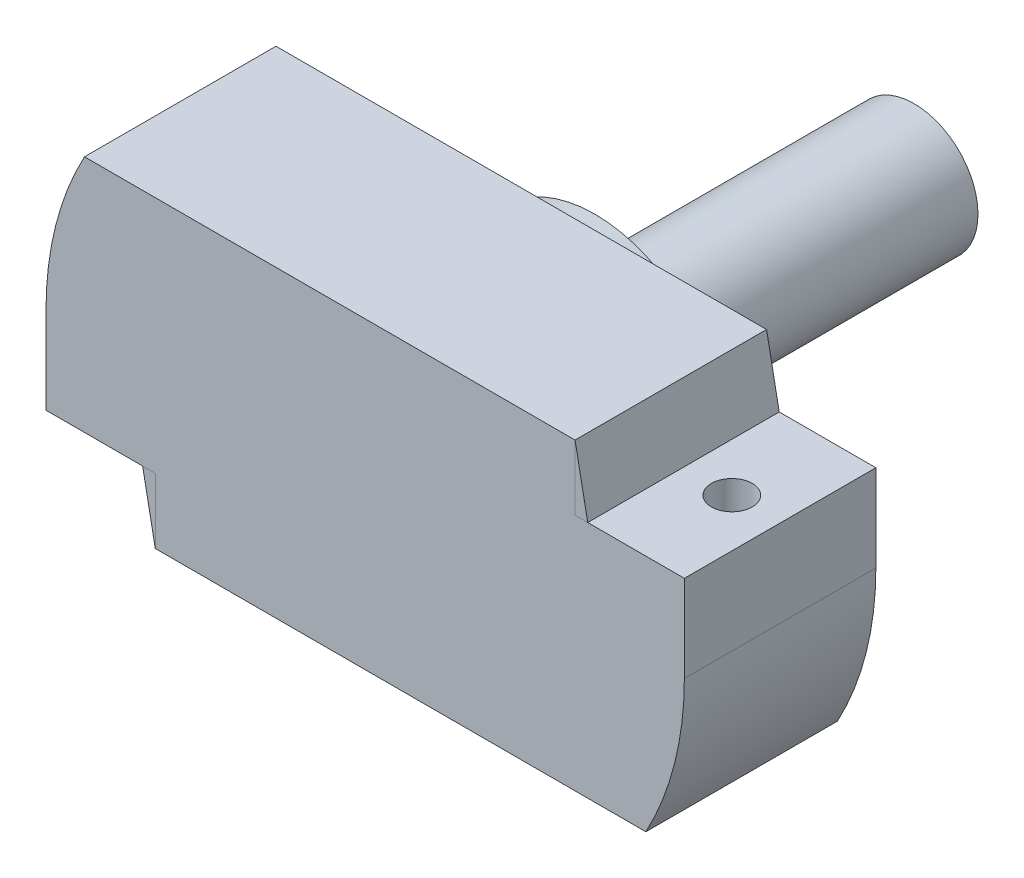
ISO-10303-21;
HEADER;
FILE_DESCRIPTION(('STEP AP214'),'2;1');
FILE_NAME('part.step','',(''),(''),'','','');
FILE_SCHEMA(('AUTOMOTIVE_DESIGN { 1 0 10303 214 1 1 1 1 }'));
ENDSEC;
DATA;
#1=APPLICATION_CONTEXT('core data for automotive mechanical design processes');
#2=APPLICATION_PROTOCOL_DEFINITION('international standard','automotive_design',2000,#1);
#3=PRODUCT_CONTEXT('',#1,'mechanical');
#4=PRODUCT('Part','Part','',(#3));
#5=PRODUCT_RELATED_PRODUCT_CATEGORY('part','',(#4));
#6=PRODUCT_DEFINITION_FORMATION('','',#4);
#7=PRODUCT_DEFINITION_CONTEXT('part definition',#1,'design');
#8=PRODUCT_DEFINITION('design','',#6,#7);
#9=PRODUCT_DEFINITION_SHAPE('','',#8);
#10=(LENGTH_UNIT() NAMED_UNIT(*) SI_UNIT(.MILLI.,.METRE.));
#11=(NAMED_UNIT(*) PLANE_ANGLE_UNIT() SI_UNIT($,.RADIAN.));
#12=(NAMED_UNIT(*) SI_UNIT($,.STERADIAN.) SOLID_ANGLE_UNIT());
#13=UNCERTAINTY_MEASURE_WITH_UNIT(LENGTH_MEASURE(1.E-05),#10,'distance_accuracy_value','');
#14=(GEOMETRIC_REPRESENTATION_CONTEXT(3) GLOBAL_UNCERTAINTY_ASSIGNED_CONTEXT((#13)) GLOBAL_UNIT_ASSIGNED_CONTEXT((#10,
#11,#12)) REPRESENTATION_CONTEXT('',''));
#15=CARTESIAN_POINT('',(0.,0.,0.));
#16=DIRECTION('',(0.,0.,1.));
#17=DIRECTION('',(1.,0.,0.));
#18=AXIS2_PLACEMENT_3D('',#15,#16,#17);
#19=CARTESIAN_POINT('',(-16.44,-6.8,28.));
#20=DIRECTION('',(1.,0.,0.));
#21=DIRECTION('',(0.,0.,-1.));
#22=AXIS2_PLACEMENT_3D('',#19,#20,#21);
#23=PLANE('',#22);
#24=DIRECTION('',(0.,1.,0.));
#25=VECTOR('',#24,1.);
#26=CARTESIAN_POINT('',(-16.44,-6.8,43.));
#27=LINE('',#26,#25);
#28=CARTESIAN_POINT('',(-16.44,-11.9,43.));
#29=VERTEX_POINT('',#28);
#30=CARTESIAN_POINT('',(-16.44,-6.8,43.));
#31=VERTEX_POINT('',#30);
#32=EDGE_CURVE('E100',#29,#31,#27,.T.);
#33=ORIENTED_EDGE('',*,*,#32,.F.);
#34=DIRECTION('',(0.,0.,1.));
#35=VECTOR('',#34,1.);
#36=CARTESIAN_POINT('',(-16.44,-11.9,28.));
#37=LINE('',#36,#35);
#38=CARTESIAN_POINT('',(-16.44,-11.9,28.));
#39=VERTEX_POINT('',#38);
#40=EDGE_CURVE('E12',#39,#29,#37,.T.);
#41=ORIENTED_EDGE('',*,*,#40,.F.);
#42=DIRECTION('',(0.,1.,0.));
#43=VECTOR('',#42,1.);
#44=CARTESIAN_POINT('',(-16.44,-6.8,28.));
#45=LINE('',#44,#43);
#46=CARTESIAN_POINT('',(-16.44,-6.8,28.));
#47=VERTEX_POINT('',#46);
#48=EDGE_CURVE('E92',#39,#47,#45,.T.);
#49=ORIENTED_EDGE('',*,*,#48,.T.);
#50=DIRECTION('',(0.,0.,1.));
#51=VECTOR('',#50,1.);
#52=CARTESIAN_POINT('',(-16.44,-6.8,28.));
#53=LINE('',#52,#51);
#54=EDGE_CURVE('E51',#47,#31,#53,.T.);
#55=ORIENTED_EDGE('',*,*,#54,.T.);
#56=EDGE_LOOP('',(#33,#41,#49,#55));
#57=FACE_BOUND('',#56,.T.);
#58=ADVANCED_FACE('F48',(#57),#23,.T.);
#59=CARTESIAN_POINT('',(-16.44,-11.9,28.));
#60=DIRECTION('',(-0.981627183447665,-0.190808995376542,0.));
#61=DIRECTION('',(0.190808995376542,-0.981627183447665,0.));
#62=AXIS2_PLACEMENT_3D('',#59,#60,#61);
#63=PLANE('',#62);
#64=DIRECTION('',(0.190808995376542,-0.981627183447664,0.));
#65=VECTOR('',#64,1.);
#66=CARTESIAN_POINT('',(-16.44,-11.9,43.));
#67=LINE('',#66,#65);
#68=CARTESIAN_POINT('',(-17.4313395766024,-6.8,43.));
#69=VERTEX_POINT('',#68);
#70=EDGE_CURVE('E94',#69,#29,#67,.T.);
#71=ORIENTED_EDGE('',*,*,#70,.F.);
#72=DIRECTION('',(0.,0.,1.));
#73=VECTOR('',#72,1.);
#74=CARTESIAN_POINT('',(-17.4313395766024,-6.8,28.));
#75=LINE('',#74,#73);
#76=CARTESIAN_POINT('',(-17.4313395766024,-6.8,28.));
#77=VERTEX_POINT('',#76);
#78=EDGE_CURVE('E57',#77,#69,#75,.T.);
#79=ORIENTED_EDGE('',*,*,#78,.F.);
#80=DIRECTION('',(0.190808995376542,-0.981627183447664,0.));
#81=VECTOR('',#80,1.);
#82=CARTESIAN_POINT('',(-16.44,-11.9,28.));
#83=LINE('',#82,#81);
#84=EDGE_CURVE('E89',#77,#39,#83,.T.);
#85=ORIENTED_EDGE('',*,*,#84,.T.);
#86=ORIENTED_EDGE('',*,*,#40,.T.);
#87=EDGE_LOOP('',(#71,#79,#85,#86));
#88=FACE_BOUND('',#87,.T.);
#89=ADVANCED_FACE('F104',(#88),#63,.T.);
#90=CARTESIAN_POINT('',(-17.4313395766024,-6.8,28.));
#91=DIRECTION('',(0.,1.,0.));
#92=DIRECTION('',(0.,0.,1.));
#93=AXIS2_PLACEMENT_3D('',#90,#91,#92);
#94=PLANE('',#93);
#95=DIRECTION('',(-1.,0.,0.));
#96=VECTOR('',#95,1.);
#97=CARTESIAN_POINT('',(-17.4313395766024,-6.8,43.));
#98=LINE('',#97,#96);
#99=EDGE_CURVE('E87',#31,#69,#98,.T.);
#100=ORIENTED_EDGE('',*,*,#99,.F.);
#101=ORIENTED_EDGE('',*,*,#54,.F.);
#102=DIRECTION('',(-1.,0.,0.));
#103=VECTOR('',#102,1.);
#104=CARTESIAN_POINT('',(-17.4313395766024,-6.8,28.));
#105=LINE('',#104,#103);
#106=EDGE_CURVE('E85',#47,#77,#105,.T.);
#107=ORIENTED_EDGE('',*,*,#106,.T.);
#108=ORIENTED_EDGE('',*,*,#78,.T.);
#109=EDGE_LOOP('',(#100,#101,#107,#108));
#110=FACE_BOUND('',#109,.T.);
#111=ADVANCED_FACE('F84',(#110),#94,.T.);
#112=CARTESIAN_POINT('',(0.,0.,28.));
#113=DIRECTION('',(0.,0.,1.));
#114=DIRECTION('',(1.,0.,0.));
#115=AXIS2_PLACEMENT_3D('',#112,#113,#114);
#116=PLANE('',#115);
#117=ORIENTED_EDGE('',*,*,#48,.F.);
#118=ORIENTED_EDGE('',*,*,#84,.F.);
#119=ORIENTED_EDGE('',*,*,#106,.F.);
#120=EDGE_LOOP('',(#117,#118,#119));
#121=FACE_BOUND('',#120,.T.);
#122=ADVANCED_FACE('F91',(#121),#116,.F.);
#123=CARTESIAN_POINT('',(0.,0.,43.));
#124=DIRECTION('',(0.,0.,1.));
#125=DIRECTION('',(1.,0.,0.));
#126=AXIS2_PLACEMENT_3D('',#123,#124,#125);
#127=PLANE('',#126);
#128=ORIENTED_EDGE('',*,*,#32,.T.);
#129=ORIENTED_EDGE('',*,*,#99,.T.);
#130=ORIENTED_EDGE('',*,*,#70,.T.);
#131=EDGE_LOOP('',(#128,#129,#130));
#132=FACE_BOUND('',#131,.T.);
#133=ADVANCED_FACE('F103',(#132),#127,.T.);
#134=CLOSED_SHELL('',(#58,#89,#111,#122,#133));
#135=MANIFOLD_SOLID_BREP('B2',#134);
#136=CARTESIAN_POINT('',(16.44,11.9,28.));
#137=DIRECTION('',(-1.,0.,0.));
#138=DIRECTION('',(0.,0.,1.));
#139=AXIS2_PLACEMENT_3D('',#136,#137,#138);
#140=PLANE('',#139);
#141=DIRECTION('',(0.,-1.,0.));
#142=VECTOR('',#141,1.);
#143=CARTESIAN_POINT('',(16.44,11.9,43.));
#144=LINE('',#143,#142);
#145=CARTESIAN_POINT('',(16.44,11.9,43.));
#146=VERTEX_POINT('',#145);
#147=CARTESIAN_POINT('',(16.44,6.8,43.));
#148=VERTEX_POINT('',#147);
#149=EDGE_CURVE('E207',#146,#148,#144,.T.);
#150=ORIENTED_EDGE('',*,*,#149,.F.);
#151=DIRECTION('',(0.,0.,1.));
#152=VECTOR('',#151,1.);
#153=CARTESIAN_POINT('',(16.44,11.9,28.));
#154=LINE('',#153,#152);
#155=CARTESIAN_POINT('',(16.44,11.9,28.));
#156=VERTEX_POINT('',#155);
#157=EDGE_CURVE('E46',#156,#146,#154,.T.);
#158=ORIENTED_EDGE('',*,*,#157,.F.);
#159=DIRECTION('',(0.,-1.,0.));
#160=VECTOR('',#159,1.);
#161=CARTESIAN_POINT('',(16.44,11.9,28.));
#162=LINE('',#161,#160);
#163=CARTESIAN_POINT('',(16.44,6.8,28.));
#164=VERTEX_POINT('',#163);
#165=EDGE_CURVE('E199',#156,#164,#162,.T.);
#166=ORIENTED_EDGE('',*,*,#165,.T.);
#167=DIRECTION('',(0.,0.,1.));
#168=VECTOR('',#167,1.);
#169=CARTESIAN_POINT('',(16.44,6.8,28.));
#170=LINE('',#169,#168);
#171=EDGE_CURVE('E158',#164,#148,#170,.T.);
#172=ORIENTED_EDGE('',*,*,#171,.T.);
#173=EDGE_LOOP('',(#150,#158,#166,#172));
#174=FACE_BOUND('',#173,.T.);
#175=ADVANCED_FACE('F155',(#174),#140,.T.);
#176=CARTESIAN_POINT('',(16.44,11.9,28.));
#177=DIRECTION('',(0.981627183447665,0.190808995376542,0.));
#178=DIRECTION('',(-0.190808995376542,0.981627183447665,0.));
#179=AXIS2_PLACEMENT_3D('',#176,#177,#178);
#180=PLANE('',#179);
#181=DIRECTION('',(-0.190808995376542,0.981627183447664,0.));
#182=VECTOR('',#181,1.);
#183=CARTESIAN_POINT('',(16.44,11.9,43.));
#184=LINE('',#183,#182);
#185=CARTESIAN_POINT('',(17.4313395766023,6.8,43.));
#186=VERTEX_POINT('',#185);
#187=EDGE_CURVE('E201',#186,#146,#184,.T.);
#188=ORIENTED_EDGE('',*,*,#187,.F.);
#189=DIRECTION('',(0.,0.,1.));
#190=VECTOR('',#189,1.);
#191=CARTESIAN_POINT('',(17.4313395766023,6.8,28.));
#192=LINE('',#191,#190);
#193=CARTESIAN_POINT('',(17.4313395766023,6.8,28.));
#194=VERTEX_POINT('',#193);
#195=EDGE_CURVE('E164',#194,#186,#192,.T.);
#196=ORIENTED_EDGE('',*,*,#195,.F.);
#197=DIRECTION('',(-0.190808995376542,0.981627183447664,0.));
#198=VECTOR('',#197,1.);
#199=CARTESIAN_POINT('',(16.44,11.9,28.));
#200=LINE('',#199,#198);
#201=EDGE_CURVE('E196',#194,#156,#200,.T.);
#202=ORIENTED_EDGE('',*,*,#201,.T.);
#203=ORIENTED_EDGE('',*,*,#157,.T.);
#204=EDGE_LOOP('',(#188,#196,#202,#203));
#205=FACE_BOUND('',#204,.T.);
#206=ADVANCED_FACE('F211',(#205),#180,.T.);
#207=CARTESIAN_POINT('',(16.44,6.8,28.));
#208=DIRECTION('',(0.,-1.,0.));
#209=DIRECTION('',(0.,0.,-1.));
#210=AXIS2_PLACEMENT_3D('',#207,#208,#209);
#211=PLANE('',#210);
#212=DIRECTION('',(1.,0.,0.));
#213=VECTOR('',#212,1.);
#214=CARTESIAN_POINT('',(16.44,6.8,43.));
#215=LINE('',#214,#213);
#216=EDGE_CURVE('E194',#148,#186,#215,.T.);
#217=ORIENTED_EDGE('',*,*,#216,.F.);
#218=ORIENTED_EDGE('',*,*,#171,.F.);
#219=DIRECTION('',(1.,0.,0.));
#220=VECTOR('',#219,1.);
#221=CARTESIAN_POINT('',(16.44,6.8,28.));
#222=LINE('',#221,#220);
#223=EDGE_CURVE('E192',#164,#194,#222,.T.);
#224=ORIENTED_EDGE('',*,*,#223,.T.);
#225=ORIENTED_EDGE('',*,*,#195,.T.);
#226=EDGE_LOOP('',(#217,#218,#224,#225));
#227=FACE_BOUND('',#226,.T.);
#228=ADVANCED_FACE('F191',(#227),#211,.T.);
#229=CARTESIAN_POINT('',(0.,0.,28.));
#230=DIRECTION('',(0.,0.,1.));
#231=DIRECTION('',(1.,0.,0.));
#232=AXIS2_PLACEMENT_3D('',#229,#230,#231);
#233=PLANE('',#232);
#234=ORIENTED_EDGE('',*,*,#165,.F.);
#235=ORIENTED_EDGE('',*,*,#201,.F.);
#236=ORIENTED_EDGE('',*,*,#223,.F.);
#237=EDGE_LOOP('',(#234,#235,#236));
#238=FACE_BOUND('',#237,.T.);
#239=ADVANCED_FACE('F198',(#238),#233,.F.);
#240=CARTESIAN_POINT('',(0.,0.,43.));
#241=DIRECTION('',(0.,0.,1.));
#242=DIRECTION('',(1.,0.,0.));
#243=AXIS2_PLACEMENT_3D('',#240,#241,#242);
#244=PLANE('',#243);
#245=ORIENTED_EDGE('',*,*,#149,.T.);
#246=ORIENTED_EDGE('',*,*,#216,.T.);
#247=ORIENTED_EDGE('',*,*,#187,.T.);
#248=EDGE_LOOP('',(#245,#246,#247));
#249=FACE_BOUND('',#248,.T.);
#250=ADVANCED_FACE('F210',(#249),#244,.T.);
#251=CLOSED_SHELL('',(#175,#206,#228,#239,#250));
#252=MANIFOLD_SOLID_BREP('B6',#251);
#253=CARTESIAN_POINT('',(-25.,11.9,43.));
#254=DIRECTION('',(1.,0.,0.));
#255=DIRECTION('',(0.,1.,0.));
#256=AXIS2_PLACEMENT_3D('',#253,#254,#255);
#257=PLANE('',#256);
#258=DIRECTION('',(0.,0.,-1.));
#259=VECTOR('',#258,1.);
#260=CARTESIAN_POINT('',(-25.,-6.8,43.));
#261=LINE('',#260,#259);
#262=CARTESIAN_POINT('',(-25.,-6.8,43.));
#263=VERTEX_POINT('',#262);
#264=CARTESIAN_POINT('',(-25.,-6.8,28.));
#265=VERTEX_POINT('',#264);
#266=EDGE_CURVE('E329',#263,#265,#261,.T.);
#267=ORIENTED_EDGE('',*,*,#266,.F.);
#268=DIRECTION('',(0.,-1.,0.));
#269=VECTOR('',#268,1.);
#270=CARTESIAN_POINT('',(-25.,11.9,43.));
#271=LINE('',#270,#269);
#272=CARTESIAN_POINT('',(-25.,0.,43.));
#273=VERTEX_POINT('',#272);
#274=EDGE_CURVE('E365',#273,#263,#271,.T.);
#275=ORIENTED_EDGE('',*,*,#274,.F.);
#276=DIRECTION('',(0.,0.,1.));
#277=VECTOR('',#276,1.);
#278=CARTESIAN_POINT('',(-25.,0.,0.));
#279=LINE('',#278,#277);
#280=CARTESIAN_POINT('',(-25.,0.,28.));
#281=VERTEX_POINT('',#280);
#282=EDGE_CURVE('E350',#281,#273,#279,.T.);
#283=ORIENTED_EDGE('',*,*,#282,.F.);
#284=DIRECTION('',(0.,-1.,0.));
#285=VECTOR('',#284,1.);
#286=CARTESIAN_POINT('',(-25.,11.9,28.));
#287=LINE('',#286,#285);
#288=EDGE_CURVE('E346',#281,#265,#287,.T.);
#289=ORIENTED_EDGE('',*,*,#288,.T.);
#290=EDGE_LOOP('',(#267,#275,#283,#289));
#291=FACE_BOUND('',#290,.T.);
#292=ADVANCED_FACE('F252',(#291),#257,.F.);
#293=CARTESIAN_POINT('',(25.,11.9,43.));
#294=DIRECTION('',(-1.,0.,0.));
#295=DIRECTION('',(0.,-1.,0.));
#296=AXIS2_PLACEMENT_3D('',#293,#294,#295);
#297=PLANE('',#296);
#298=DIRECTION('',(0.,0.,-1.));
#299=VECTOR('',#298,1.);
#300=CARTESIAN_POINT('',(25.,6.8,28.));
#301=LINE('',#300,#299);
#302=CARTESIAN_POINT('',(25.,6.8,43.));
#303=VERTEX_POINT('',#302);
#304=CARTESIAN_POINT('',(25.,6.8,28.));
#305=VERTEX_POINT('',#304);
#306=EDGE_CURVE('E431',#303,#305,#301,.T.);
#307=ORIENTED_EDGE('',*,*,#306,.F.);
#308=DIRECTION('',(0.,1.,0.));
#309=VECTOR('',#308,1.);
#310=CARTESIAN_POINT('',(25.,11.9,43.));
#311=LINE('',#310,#309);
#312=CARTESIAN_POINT('',(25.,0.,43.));
#313=VERTEX_POINT('',#312);
#314=EDGE_CURVE('E394',#313,#303,#311,.T.);
#315=ORIENTED_EDGE('',*,*,#314,.F.);
#316=DIRECTION('',(0.,0.,1.));
#317=VECTOR('',#316,1.);
#318=CARTESIAN_POINT('',(25.,0.,0.));
#319=LINE('',#318,#317);
#320=CARTESIAN_POINT('',(25.,0.,28.));
#321=VERTEX_POINT('',#320);
#322=EDGE_CURVE('E385',#321,#313,#319,.T.);
#323=ORIENTED_EDGE('',*,*,#322,.F.);
#324=DIRECTION('',(0.,1.,0.));
#325=VECTOR('',#324,1.);
#326=CARTESIAN_POINT('',(25.,11.9,28.));
#327=LINE('',#326,#325);
#328=EDGE_CURVE('E353',#321,#305,#327,.T.);
#329=ORIENTED_EDGE('',*,*,#328,.T.);
#330=EDGE_LOOP('',(#307,#315,#323,#329));
#331=FACE_BOUND('',#330,.T.);
#332=ADVANCED_FACE('F392',(#331),#297,.F.);
#333=CARTESIAN_POINT('',(0.,0.,43.));
#334=DIRECTION('',(0.,0.,1.));
#335=DIRECTION('',(1.,0.,0.));
#336=AXIS2_PLACEMENT_3D('',#333,#334,#335);
#337=PLANE('',#336);
#338=DIRECTION('',(0.,-1.,0.));
#339=VECTOR('',#338,1.);
#340=CARTESIAN_POINT('',(-16.44,-6.8,43.));
#341=LINE('',#340,#339);
#342=CARTESIAN_POINT('',(-16.44,-6.8,43.));
#343=VERTEX_POINT('',#342);
#344=CARTESIAN_POINT('',(-16.44,-11.9,43.));
#345=VERTEX_POINT('',#344);
#346=EDGE_CURVE('E440',#343,#345,#341,.T.);
#347=ORIENTED_EDGE('',*,*,#346,.T.);
#348=DIRECTION('',(1.,0.,0.));
#349=VECTOR('',#348,1.);
#350=CARTESIAN_POINT('',(-25.,-11.9,43.));
#351=LINE('',#350,#349);
#352=CARTESIAN_POINT('',(21.9861319926903,-11.9,43.));
#353=VERTEX_POINT('',#352);
#354=EDGE_CURVE('E402',#345,#353,#351,.T.);
#355=ORIENTED_EDGE('',*,*,#354,.T.);
#356=CARTESIAN_POINT('',(0.,0.,43.));
#357=DIRECTION('',(0.,0.,-1.));
#358=DIRECTION('',(1.,0.,0.));
#359=AXIS2_PLACEMENT_3D('',#356,#357,#358);
#360=CIRCLE('',#359,25.);
#361=EDGE_CURVE('E395',#313,#353,#360,.T.);
#362=ORIENTED_EDGE('',*,*,#361,.F.);
#363=ORIENTED_EDGE('',*,*,#314,.T.);
#364=DIRECTION('',(1.,0.,0.));
#365=VECTOR('',#364,1.);
#366=CARTESIAN_POINT('',(16.44,6.8,43.));
#367=LINE('',#366,#365);
#368=CARTESIAN_POINT('',(16.44,6.8,43.));
#369=VERTEX_POINT('',#368);
#370=EDGE_CURVE('E433',#369,#303,#367,.T.);
#371=ORIENTED_EDGE('',*,*,#370,.F.);
#372=DIRECTION('',(0.,1.,0.));
#373=VECTOR('',#372,1.);
#374=CARTESIAN_POINT('',(16.44,6.8,43.));
#375=LINE('',#374,#373);
#376=CARTESIAN_POINT('',(16.44,11.9,43.));
#377=VERTEX_POINT('',#376);
#378=EDGE_CURVE('E411',#369,#377,#375,.T.);
#379=ORIENTED_EDGE('',*,*,#378,.T.);
#380=DIRECTION('',(-1.,0.,0.));
#381=VECTOR('',#380,1.);
#382=CARTESIAN_POINT('',(-25.,11.9,43.));
#383=LINE('',#382,#381);
#384=CARTESIAN_POINT('',(-21.9861319926903,11.9,43.));
#385=VERTEX_POINT('',#384);
#386=EDGE_CURVE('E358',#377,#385,#383,.T.);
#387=ORIENTED_EDGE('',*,*,#386,.T.);
#388=CARTESIAN_POINT('',(0.,0.,43.));
#389=DIRECTION('',(0.,0.,-1.));
#390=DIRECTION('',(1.,0.,0.));
#391=AXIS2_PLACEMENT_3D('',#388,#389,#390);
#392=CIRCLE('',#391,25.);
#393=EDGE_CURVE('E397',#273,#385,#392,.T.);
#394=ORIENTED_EDGE('',*,*,#393,.F.);
#395=ORIENTED_EDGE('',*,*,#274,.T.);
#396=DIRECTION('',(-1.,0.,0.));
#397=VECTOR('',#396,1.);
#398=CARTESIAN_POINT('',(-25.,-6.8,43.));
#399=LINE('',#398,#397);
#400=EDGE_CURVE('E335',#343,#263,#399,.T.);
#401=ORIENTED_EDGE('',*,*,#400,.F.);
#402=EDGE_LOOP('',(#347,#355,#362,#363,#371,#379,#387,#394,#395,#401));
#403=FACE_BOUND('',#402,.T.);
#404=ADVANCED_FACE('F410',(#403),#337,.T.);
#405=CARTESIAN_POINT('',(0.,0.,28.));
#406=DIRECTION('',(0.,0.,1.));
#407=DIRECTION('',(1.,0.,0.));
#408=AXIS2_PLACEMENT_3D('',#405,#406,#407);
#409=PLANE('',#408);
#410=CARTESIAN_POINT('',(0.,0.,28.));
#411=DIRECTION('',(0.,0.,1.));
#412=DIRECTION('',(1.,0.,0.));
#413=AXIS2_PLACEMENT_3D('',#410,#411,#412);
#414=CIRCLE('',#413,10.);
#415=CARTESIAN_POINT('',(10.,0.,28.));
#416=VERTEX_POINT('',#415);
#417=EDGE_CURVE('E366',#416,#416,#414,.T.);
#418=ORIENTED_EDGE('',*,*,#417,.T.);
#419=EDGE_LOOP('',(#418));
#420=FACE_BOUND('',#419,.T.);
#421=DIRECTION('',(1.,0.,0.));
#422=VECTOR('',#421,1.);
#423=CARTESIAN_POINT('',(-25.,-11.9,28.));
#424=LINE('',#423,#422);
#425=CARTESIAN_POINT('',(-16.44,-11.9,28.));
#426=VERTEX_POINT('',#425);
#427=CARTESIAN_POINT('',(21.9861319926903,-11.9,28.));
#428=VERTEX_POINT('',#427);
#429=EDGE_CURVE('E351',#426,#428,#424,.T.);
#430=ORIENTED_EDGE('',*,*,#429,.F.);
#431=DIRECTION('',(0.,-1.,0.));
#432=VECTOR('',#431,1.);
#433=CARTESIAN_POINT('',(-16.44,-6.8,28.));
#434=LINE('',#433,#432);
#435=CARTESIAN_POINT('',(-16.44,-6.8,28.));
#436=VERTEX_POINT('',#435);
#437=EDGE_CURVE('E267',#436,#426,#434,.T.);
#438=ORIENTED_EDGE('',*,*,#437,.F.);
#439=DIRECTION('',(1.,0.,0.));
#440=VECTOR('',#439,1.);
#441=CARTESIAN_POINT('',(-25.,-6.8,28.));
#442=LINE('',#441,#440);
#443=EDGE_CURVE('E333',#265,#436,#442,.T.);
#444=ORIENTED_EDGE('',*,*,#443,.F.);
#445=ORIENTED_EDGE('',*,*,#288,.F.);
#446=CARTESIAN_POINT('',(0.,0.,28.));
#447=DIRECTION('',(0.,0.,1.));
#448=DIRECTION('',(1.,0.,0.));
#449=AXIS2_PLACEMENT_3D('',#446,#447,#448);
#450=CIRCLE('',#449,25.);
#451=CARTESIAN_POINT('',(-21.9861319926903,11.9,28.));
#452=VERTEX_POINT('',#451);
#453=EDGE_CURVE('E153',#281,#452,#450,.F.);
#454=ORIENTED_EDGE('',*,*,#453,.T.);
#455=DIRECTION('',(-1.,0.,0.));
#456=VECTOR('',#455,1.);
#457=CARTESIAN_POINT('',(-25.,11.9,28.));
#458=LINE('',#457,#456);
#459=CARTESIAN_POINT('',(16.44,11.9,28.));
#460=VERTEX_POINT('',#459);
#461=EDGE_CURVE('E363',#460,#452,#458,.T.);
#462=ORIENTED_EDGE('',*,*,#461,.F.);
#463=DIRECTION('',(0.,1.,0.));
#464=VECTOR('',#463,1.);
#465=CARTESIAN_POINT('',(16.44,6.8,28.));
#466=LINE('',#465,#464);
#467=CARTESIAN_POINT('',(16.44,6.8,28.));
#468=VERTEX_POINT('',#467);
#469=EDGE_CURVE('E275',#468,#460,#466,.T.);
#470=ORIENTED_EDGE('',*,*,#469,.F.);
#471=DIRECTION('',(-1.,0.,0.));
#472=VECTOR('',#471,1.);
#473=CARTESIAN_POINT('',(16.44,6.8,28.));
#474=LINE('',#473,#472);
#475=EDGE_CURVE('E423',#305,#468,#474,.T.);
#476=ORIENTED_EDGE('',*,*,#475,.F.);
#477=ORIENTED_EDGE('',*,*,#328,.F.);
#478=CARTESIAN_POINT('',(0.,0.,28.));
#479=DIRECTION('',(0.,0.,1.));
#480=DIRECTION('',(1.,0.,0.));
#481=AXIS2_PLACEMENT_3D('',#478,#479,#480);
#482=CIRCLE('',#481,25.);
#483=EDGE_CURVE('E260',#321,#428,#482,.F.);
#484=ORIENTED_EDGE('',*,*,#483,.T.);
#485=EDGE_LOOP('',(#430,#438,#444,#445,#454,#462,#470,#476,#477,#484));
#486=FACE_BOUND('',#485,.T.);
#487=ADVANCED_FACE('F345',(#420,#486),#409,.F.);
#488=CARTESIAN_POINT('',(0.,0.,25.));
#489=DIRECTION('',(0.,0.,-1.));
#490=DIRECTION('',(-1.,0.,0.));
#491=AXIS2_PLACEMENT_3D('',#488,#489,#490);
#492=CYLINDRICAL_SURFACE('',#491,5.);
#493=CARTESIAN_POINT('',(0.,0.,25.));
#494=DIRECTION('',(0.,0.,1.));
#495=DIRECTION('',(1.,0.,0.));
#496=AXIS2_PLACEMENT_3D('',#493,#494,#495);
#497=CIRCLE('',#496,5.);
#498=CARTESIAN_POINT('',(5.,0.,25.));
#499=VERTEX_POINT('',#498);
#500=EDGE_CURVE('E373',#499,#499,#497,.T.);
#501=ORIENTED_EDGE('',*,*,#500,.F.);
#502=EDGE_LOOP('',(#501));
#503=FACE_BOUND('',#502,.T.);
#504=CARTESIAN_POINT('',(0.,0.,0.));
#505=DIRECTION('',(0.,0.,1.));
#506=DIRECTION('',(1.,0.,0.));
#507=AXIS2_PLACEMENT_3D('',#504,#505,#506);
#508=CIRCLE('',#507,5.);
#509=CARTESIAN_POINT('',(5.,0.,0.));
#510=VERTEX_POINT('',#509);
#511=EDGE_CURVE('E369',#510,#510,#508,.T.);
#512=ORIENTED_EDGE('',*,*,#511,.T.);
#513=EDGE_LOOP('',(#512));
#514=FACE_BOUND('',#513,.T.);
#515=ADVANCED_FACE('F254',(#503,#514),#492,.T.);
#516=CARTESIAN_POINT('',(0.,0.,0.));
#517=DIRECTION('',(0.,0.,1.));
#518=DIRECTION('',(1.,0.,0.));
#519=AXIS2_PLACEMENT_3D('',#516,#517,#518);
#520=PLANE('',#519);
#521=ORIENTED_EDGE('',*,*,#511,.F.);
#522=EDGE_LOOP('',(#521));
#523=FACE_BOUND('',#522,.T.);
#524=ADVANCED_FACE('F486',(#523),#520,.F.);
#525=CARTESIAN_POINT('',(0.,0.,28.));
#526=DIRECTION('',(0.,0.,-1.));
#527=DIRECTION('',(-1.,0.,0.));
#528=AXIS2_PLACEMENT_3D('',#525,#526,#527);
#529=CYLINDRICAL_SURFACE('',#528,10.);
#530=ORIENTED_EDGE('',*,*,#417,.F.);
#531=EDGE_LOOP('',(#530));
#532=FACE_BOUND('',#531,.T.);
#533=CARTESIAN_POINT('',(0.,0.,25.));
#534=DIRECTION('',(0.,0.,1.));
#535=DIRECTION('',(1.,0.,0.));
#536=AXIS2_PLACEMENT_3D('',#533,#534,#535);
#537=CIRCLE('',#536,10.);
#538=CARTESIAN_POINT('',(10.,0.,25.));
#539=VERTEX_POINT('',#538);
#540=EDGE_CURVE('E370',#539,#539,#537,.T.);
#541=ORIENTED_EDGE('',*,*,#540,.T.);
#542=EDGE_LOOP('',(#541));
#543=FACE_BOUND('',#542,.T.);
#544=ADVANCED_FACE('F483',(#532,#543),#529,.T.);
#545=CARTESIAN_POINT('',(0.,0.,25.));
#546=DIRECTION('',(0.,0.,1.));
#547=DIRECTION('',(1.,0.,0.));
#548=AXIS2_PLACEMENT_3D('',#545,#546,#547);
#549=PLANE('',#548);
#550=ORIENTED_EDGE('',*,*,#500,.T.);
#551=EDGE_LOOP('',(#550));
#552=FACE_BOUND('',#551,.T.);
#553=ORIENTED_EDGE('',*,*,#540,.F.);
#554=EDGE_LOOP('',(#553));
#555=FACE_BOUND('',#554,.T.);
#556=ADVANCED_FACE('F480',(#552,#555),#549,.F.);
#557=CARTESIAN_POINT('',(-25.,-11.9,43.));
#558=DIRECTION('',(0.,1.,0.));
#559=DIRECTION('',(-1.,0.,0.));
#560=AXIS2_PLACEMENT_3D('',#557,#558,#559);
#561=PLANE('',#560);
#562=ORIENTED_EDGE('',*,*,#354,.F.);
#563=DIRECTION('',(0.,0.,1.));
#564=VECTOR('',#563,1.);
#565=CARTESIAN_POINT('',(-16.44,-11.9,43.));
#566=LINE('',#565,#564);
#567=EDGE_CURVE('E340',#426,#345,#566,.T.);
#568=ORIENTED_EDGE('',*,*,#567,.F.);
#569=ORIENTED_EDGE('',*,*,#429,.T.);
#570=DIRECTION('',(0.,0.,1.));
#571=VECTOR('',#570,1.);
#572=CARTESIAN_POINT('',(21.9861319926903,-11.9,0.));
#573=LINE('',#572,#571);
#574=EDGE_CURVE('E388',#428,#353,#573,.T.);
#575=ORIENTED_EDGE('',*,*,#574,.T.);
#576=EDGE_LOOP('',(#562,#568,#569,#575));
#577=FACE_BOUND('',#576,.T.);
#578=ADVANCED_FACE('F479',(#577),#561,.F.);
#579=CARTESIAN_POINT('',(-25.,11.9,43.));
#580=DIRECTION('',(0.,-1.,0.));
#581=DIRECTION('',(0.,0.,-1.));
#582=AXIS2_PLACEMENT_3D('',#579,#580,#581);
#583=PLANE('',#582);
#584=ORIENTED_EDGE('',*,*,#386,.F.);
#585=DIRECTION('',(0.,0.,1.));
#586=VECTOR('',#585,1.);
#587=CARTESIAN_POINT('',(16.44,11.9,28.));
#588=LINE('',#587,#586);
#589=EDGE_CURVE('E425',#460,#377,#588,.T.);
#590=ORIENTED_EDGE('',*,*,#589,.F.);
#591=ORIENTED_EDGE('',*,*,#461,.T.);
#592=DIRECTION('',(0.,0.,1.));
#593=VECTOR('',#592,1.);
#594=CARTESIAN_POINT('',(-21.9861319926903,11.9,0.));
#595=LINE('',#594,#593);
#596=EDGE_CURVE('E355',#452,#385,#595,.T.);
#597=ORIENTED_EDGE('',*,*,#596,.T.);
#598=EDGE_LOOP('',(#584,#590,#591,#597));
#599=FACE_BOUND('',#598,.T.);
#600=ADVANCED_FACE('F418',(#599),#583,.F.);
#601=CARTESIAN_POINT('',(0.,0.,0.));
#602=DIRECTION('',(0.,0.,1.));
#603=DIRECTION('',(1.,0.,0.));
#604=AXIS2_PLACEMENT_3D('',#601,#602,#603);
#605=CYLINDRICAL_SURFACE('',#604,25.);
#606=ORIENTED_EDGE('',*,*,#322,.T.);
#607=ORIENTED_EDGE('',*,*,#361,.T.);
#608=ORIENTED_EDGE('',*,*,#574,.F.);
#609=ORIENTED_EDGE('',*,*,#483,.F.);
#610=EDGE_LOOP('',(#606,#607,#608,#609));
#611=FACE_BOUND('',#610,.T.);
#612=ADVANCED_FACE('F383',(#611),#605,.T.);
#613=CARTESIAN_POINT('',(0.,0.,0.));
#614=DIRECTION('',(0.,0.,1.));
#615=DIRECTION('',(1.,0.,0.));
#616=AXIS2_PLACEMENT_3D('',#613,#614,#615);
#617=CYLINDRICAL_SURFACE('',#616,25.);
#618=ORIENTED_EDGE('',*,*,#282,.T.);
#619=ORIENTED_EDGE('',*,*,#393,.T.);
#620=ORIENTED_EDGE('',*,*,#596,.F.);
#621=ORIENTED_EDGE('',*,*,#453,.F.);
#622=EDGE_LOOP('',(#618,#619,#620,#621));
#623=FACE_BOUND('',#622,.T.);
#624=ADVANCED_FACE('F416',(#623),#617,.T.);
#625=CARTESIAN_POINT('',(16.44,6.8,28.));
#626=DIRECTION('',(-1.,0.,0.));
#627=DIRECTION('',(0.,0.,1.));
#628=AXIS2_PLACEMENT_3D('',#625,#626,#627);
#629=PLANE('',#628);
#630=ORIENTED_EDGE('',*,*,#589,.T.);
#631=ORIENTED_EDGE('',*,*,#378,.F.);
#632=DIRECTION('',(0.,0.,1.));
#633=VECTOR('',#632,1.);
#634=CARTESIAN_POINT('',(16.44,6.8,28.));
#635=LINE('',#634,#633);
#636=EDGE_CURVE('E427',#468,#369,#635,.T.);
#637=ORIENTED_EDGE('',*,*,#636,.F.);
#638=ORIENTED_EDGE('',*,*,#469,.T.);
#639=EDGE_LOOP('',(#630,#631,#637,#638));
#640=FACE_BOUND('',#639,.T.);
#641=ADVANCED_FACE('F571',(#640),#629,.F.);
#642=CARTESIAN_POINT('',(0.,6.8,0.));
#643=DIRECTION('',(0.,1.,0.));
#644=DIRECTION('',(0.,0.,1.));
#645=AXIS2_PLACEMENT_3D('',#642,#643,#644);
#646=PLANE('',#645);
#647=CARTESIAN_POINT('',(21.22,6.8,35.5));
#648=DIRECTION('',(0.,1.,0.));
#649=DIRECTION('',(0.,0.,1.));
#650=AXIS2_PLACEMENT_3D('',#647,#648,#649);
#651=CIRCLE('',#650,1.6);
#652=CARTESIAN_POINT('',(21.22,6.8,37.1));
#653=VERTEX_POINT('',#652);
#654=EDGE_CURVE('E437',#653,#653,#651,.T.);
#655=ORIENTED_EDGE('',*,*,#654,.F.);
#656=EDGE_LOOP('',(#655));
#657=FACE_BOUND('',#656,.T.);
#658=ORIENTED_EDGE('',*,*,#636,.T.);
#659=ORIENTED_EDGE('',*,*,#370,.T.);
#660=ORIENTED_EDGE('',*,*,#306,.T.);
#661=ORIENTED_EDGE('',*,*,#475,.T.);
#662=EDGE_LOOP('',(#658,#659,#660,#661));
#663=FACE_BOUND('',#662,.T.);
#664=ADVANCED_FACE('F582',(#657,#663),#646,.T.);
#665=CARTESIAN_POINT('',(21.22,-3.2,35.5));
#666=DIRECTION('',(0.,1.,0.));
#667=DIRECTION('',(0.,0.,1.));
#668=AXIS2_PLACEMENT_3D('',#665,#666,#667);
#669=CYLINDRICAL_SURFACE('',#668,1.6);
#670=CARTESIAN_POINT('',(21.22,-3.2,35.5));
#671=DIRECTION('',(0.,1.,0.));
#672=DIRECTION('',(0.,0.,1.));
#673=AXIS2_PLACEMENT_3D('',#670,#671,#672);
#674=CIRCLE('',#673,1.6);
#675=CARTESIAN_POINT('',(21.22,-3.2,37.1));
#676=VERTEX_POINT('',#675);
#677=EDGE_CURVE('E428',#676,#676,#674,.T.);
#678=ORIENTED_EDGE('',*,*,#677,.F.);
#679=EDGE_LOOP('',(#678));
#680=FACE_BOUND('',#679,.T.);
#681=ORIENTED_EDGE('',*,*,#654,.T.);
#682=EDGE_LOOP('',(#681));
#683=FACE_BOUND('',#682,.T.);
#684=ADVANCED_FACE('F590',(#680,#683),#669,.F.);
#685=CARTESIAN_POINT('',(21.22,-3.2,35.5));
#686=DIRECTION('',(0.,1.,0.));
#687=DIRECTION('',(0.,0.,1.));
#688=AXIS2_PLACEMENT_3D('',#685,#686,#687);
#689=PLANE('',#688);
#690=ORIENTED_EDGE('',*,*,#677,.T.);
#691=EDGE_LOOP('',(#690));
#692=FACE_BOUND('',#691,.T.);
#693=ADVANCED_FACE('F469',(#692),#689,.T.);
#694=CARTESIAN_POINT('',(-16.44,-6.8,43.));
#695=DIRECTION('',(1.,0.,0.));
#696=DIRECTION('',(0.,1.,0.));
#697=AXIS2_PLACEMENT_3D('',#694,#695,#696);
#698=PLANE('',#697);
#699=ORIENTED_EDGE('',*,*,#567,.T.);
#700=ORIENTED_EDGE('',*,*,#346,.F.);
#701=DIRECTION('',(0.,0.,1.));
#702=VECTOR('',#701,1.);
#703=CARTESIAN_POINT('',(-16.44,-6.8,43.));
#704=LINE('',#703,#702);
#705=EDGE_CURVE('E347',#436,#343,#704,.T.);
#706=ORIENTED_EDGE('',*,*,#705,.F.);
#707=ORIENTED_EDGE('',*,*,#437,.T.);
#708=EDGE_LOOP('',(#699,#700,#706,#707));
#709=FACE_BOUND('',#708,.T.);
#710=ADVANCED_FACE('F464',(#709),#698,.F.);
#711=CARTESIAN_POINT('',(0.,-6.8,0.));
#712=DIRECTION('',(0.,-1.,0.));
#713=DIRECTION('',(0.,0.,-1.));
#714=AXIS2_PLACEMENT_3D('',#711,#712,#713);
#715=PLANE('',#714);
#716=CARTESIAN_POINT('',(-21.22,-6.8,35.5));
#717=DIRECTION('',(0.,-1.,0.));
#718=DIRECTION('',(0.,0.,-1.));
#719=AXIS2_PLACEMENT_3D('',#716,#717,#718);
#720=CIRCLE('',#719,1.6);
#721=CARTESIAN_POINT('',(-21.22,-6.8,33.9));
#722=VERTEX_POINT('',#721);
#723=EDGE_CURVE('E449',#722,#722,#720,.T.);
#724=ORIENTED_EDGE('',*,*,#723,.F.);
#725=EDGE_LOOP('',(#724));
#726=FACE_BOUND('',#725,.T.);
#727=ORIENTED_EDGE('',*,*,#266,.T.);
#728=ORIENTED_EDGE('',*,*,#443,.T.);
#729=ORIENTED_EDGE('',*,*,#705,.T.);
#730=ORIENTED_EDGE('',*,*,#400,.T.);
#731=EDGE_LOOP('',(#727,#728,#729,#730));
#732=FACE_BOUND('',#731,.T.);
#733=ADVANCED_FACE('F331',(#726,#732),#715,.T.);
#734=CARTESIAN_POINT('',(-21.22,3.2,35.5));
#735=DIRECTION('',(0.,-1.,0.));
#736=DIRECTION('',(0.,0.,-1.));
#737=AXIS2_PLACEMENT_3D('',#734,#735,#736);
#738=CYLINDRICAL_SURFACE('',#737,1.6);
#739=CARTESIAN_POINT('',(-21.22,3.2,35.5));
#740=DIRECTION('',(0.,-1.,0.));
#741=DIRECTION('',(0.,0.,-1.));
#742=AXIS2_PLACEMENT_3D('',#739,#740,#741);
#743=CIRCLE('',#742,1.6);
#744=CARTESIAN_POINT('',(-21.22,3.2,33.9));
#745=VERTEX_POINT('',#744);
#746=EDGE_CURVE('E446',#745,#745,#743,.T.);
#747=ORIENTED_EDGE('',*,*,#746,.F.);
#748=EDGE_LOOP('',(#747));
#749=FACE_BOUND('',#748,.T.);
#750=ORIENTED_EDGE('',*,*,#723,.T.);
#751=EDGE_LOOP('',(#750));
#752=FACE_BOUND('',#751,.T.);
#753=ADVANCED_FACE('F457',(#749,#752),#738,.F.);
#754=CARTESIAN_POINT('',(-21.22,3.2,35.5));
#755=DIRECTION('',(0.,-1.,0.));
#756=DIRECTION('',(0.,0.,-1.));
#757=AXIS2_PLACEMENT_3D('',#754,#755,#756);
#758=PLANE('',#757);
#759=ORIENTED_EDGE('',*,*,#746,.T.);
#760=EDGE_LOOP('',(#759));
#761=FACE_BOUND('',#760,.T.);
#762=ADVANCED_FACE('F455',(#761),#758,.T.);
#763=CLOSED_SHELL('',(#292,#332,#404,#487,#515,#524,#544,#556,#578,#600,#612,#624,#641,#664,
#684,#693,#710,#733,#753,#762));
#764=MANIFOLD_SOLID_BREP('B40',#763);
#765=ADVANCED_BREP_SHAPE_REPRESENTATION('',(#18,#135,#252,#764),#14);
#766=SHAPE_DEFINITION_REPRESENTATION(#9,#765);
ENDSEC;
END-ISO-10303-21;
